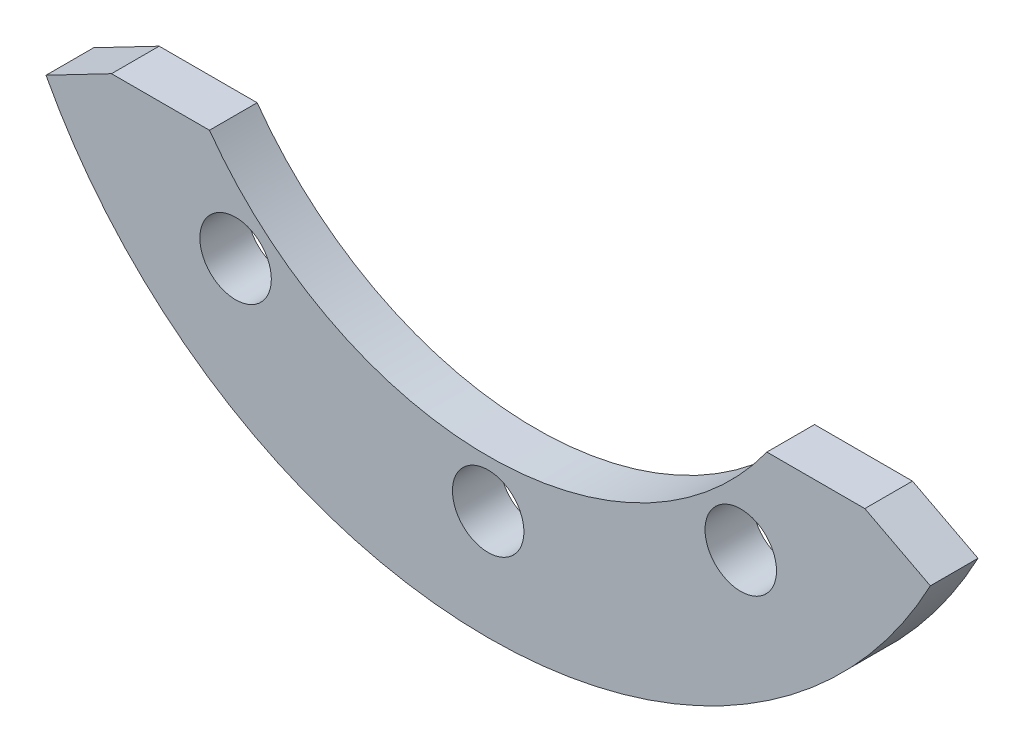
ISO-10303-21;
HEADER;
FILE_DESCRIPTION(('STEP AP214'),'2;1');
FILE_NAME('part.step','',(''),(''),'','','');
FILE_SCHEMA(('AUTOMOTIVE_DESIGN { 1 0 10303 214 1 1 1 1 }'));
ENDSEC;
DATA;
#1=APPLICATION_CONTEXT('core data for automotive mechanical design processes');
#2=APPLICATION_PROTOCOL_DEFINITION('international standard','automotive_design',2000,#1);
#3=PRODUCT_CONTEXT('',#1,'mechanical');
#4=PRODUCT('Part','Part','',(#3));
#5=PRODUCT_RELATED_PRODUCT_CATEGORY('part','',(#4));
#6=PRODUCT_DEFINITION_FORMATION('','',#4);
#7=PRODUCT_DEFINITION_CONTEXT('part definition',#1,'design');
#8=PRODUCT_DEFINITION('design','',#6,#7);
#9=PRODUCT_DEFINITION_SHAPE('','',#8);
#10=(LENGTH_UNIT() NAMED_UNIT(*) SI_UNIT(.MILLI.,.METRE.));
#11=(NAMED_UNIT(*) PLANE_ANGLE_UNIT() SI_UNIT($,.RADIAN.));
#12=(NAMED_UNIT(*) SI_UNIT($,.STERADIAN.) SOLID_ANGLE_UNIT());
#13=UNCERTAINTY_MEASURE_WITH_UNIT(LENGTH_MEASURE(1.E-05),#10,'distance_accuracy_value','');
#14=(GEOMETRIC_REPRESENTATION_CONTEXT(3) GLOBAL_UNCERTAINTY_ASSIGNED_CONTEXT((#13)) GLOBAL_UNIT_ASSIGNED_CONTEXT((#10,
#11,#12)) REPRESENTATION_CONTEXT('',''));
#15=CARTESIAN_POINT('',(0.,0.,0.));
#16=DIRECTION('',(0.,0.,1.));
#17=DIRECTION('',(1.,0.,0.));
#18=AXIS2_PLACEMENT_3D('',#15,#16,#17);
#19=CARTESIAN_POINT('',(5.84807660688538,-4.2,-1.));
#20=DIRECTION('',(0.,1.,0.));
#21=DIRECTION('',(0.,0.,1.));
#22=AXIS2_PLACEMENT_3D('',#19,#20,#21);
#23=PLANE('',#22);
#24=DIRECTION('',(-1.,0.,0.));
#25=VECTOR('',#24,1.);
#26=CARTESIAN_POINT('',(5.84807660688538,-4.2,0.));
#27=LINE('',#26,#25);
#28=CARTESIAN_POINT('',(7.90332208631282,-4.2,0.));
#29=VERTEX_POINT('',#28);
#30=CARTESIAN_POINT('',(5.84807660688538,-4.2,0.));
#31=VERTEX_POINT('',#30);
#32=EDGE_CURVE('E97',#29,#31,#27,.T.);
#33=ORIENTED_EDGE('',*,*,#32,.F.);
#34=DIRECTION('',(0.,0.,1.));
#35=VECTOR('',#34,1.);
#36=CARTESIAN_POINT('',(7.90332208631282,-4.2,-1.));
#37=LINE('',#36,#35);
#38=CARTESIAN_POINT('',(7.90332208631282,-4.2,-1.));
#39=VERTEX_POINT('',#38);
#40=EDGE_CURVE('E47',#39,#29,#37,.T.);
#41=ORIENTED_EDGE('',*,*,#40,.F.);
#42=DIRECTION('',(-1.,0.,0.));
#43=VECTOR('',#42,1.);
#44=CARTESIAN_POINT('',(5.84807660688538,-4.2,-1.));
#45=LINE('',#44,#43);
#46=CARTESIAN_POINT('',(5.84807660688538,-4.2,-1.));
#47=VERTEX_POINT('',#46);
#48=EDGE_CURVE('E95',#39,#47,#45,.T.);
#49=ORIENTED_EDGE('',*,*,#48,.T.);
#50=DIRECTION('',(0.,0.,1.));
#51=VECTOR('',#50,1.);
#52=CARTESIAN_POINT('',(5.84807660688538,-4.2,-1.));
#53=LINE('',#52,#51);
#54=EDGE_CURVE('E11',#47,#31,#53,.T.);
#55=ORIENTED_EDGE('',*,*,#54,.T.);
#56=EDGE_LOOP('',(#33,#41,#49,#55));
#57=FACE_BOUND('',#56,.T.);
#58=ADVANCED_FACE('F32',(#57),#23,.T.);
#59=CARTESIAN_POINT('',(0.,0.,-1.));
#60=DIRECTION('',(0.,0.,1.));
#61=DIRECTION('',(1.,0.,0.));
#62=AXIS2_PLACEMENT_3D('',#59,#60,#61);
#63=CYLINDRICAL_SURFACE('',#62,10.5);
#64=CARTESIAN_POINT('',(0.,0.,-1.));
#65=DIRECTION('',(0.,0.,1.));
#66=DIRECTION('',(1.,0.,0.));
#67=AXIS2_PLACEMENT_3D('',#64,#65,#66);
#68=CIRCLE('',#67,10.5);
#69=CARTESIAN_POINT('',(-9.27823124000227,-4.91573240291271,-1.));
#70=VERTEX_POINT('',#69);
#71=CARTESIAN_POINT('',(9.27823124000227,-4.91573240291271,-1.));
#72=VERTEX_POINT('',#71);
#73=EDGE_CURVE('E104',#70,#72,#68,.T.);
#74=ORIENTED_EDGE('',*,*,#73,.T.);
#75=DIRECTION('',(0.,0.,1.));
#76=VECTOR('',#75,1.);
#77=CARTESIAN_POINT('',(9.27823124000227,-4.91573240291271,-1.));
#78=LINE('',#77,#76);
#79=CARTESIAN_POINT('',(9.27823124000227,-4.91573240291271,0.));
#80=VERTEX_POINT('',#79);
#81=EDGE_CURVE('E86',#72,#80,#78,.T.);
#82=ORIENTED_EDGE('',*,*,#81,.T.);
#83=CARTESIAN_POINT('',(0.,0.,0.));
#84=DIRECTION('',(0.,0.,1.));
#85=DIRECTION('',(1.,0.,0.));
#86=AXIS2_PLACEMENT_3D('',#83,#84,#85);
#87=CIRCLE('',#86,10.5);
#88=CARTESIAN_POINT('',(-9.27823124000227,-4.91573240291271,0.));
#89=VERTEX_POINT('',#88);
#90=EDGE_CURVE('E117',#89,#80,#87,.T.);
#91=ORIENTED_EDGE('',*,*,#90,.F.);
#92=DIRECTION('',(0.,0.,1.));
#93=VECTOR('',#92,1.);
#94=CARTESIAN_POINT('',(-9.27823124000227,-4.91573240291271,-1.));
#95=LINE('',#94,#93);
#96=EDGE_CURVE('E55',#70,#89,#95,.T.);
#97=ORIENTED_EDGE('',*,*,#96,.F.);
#98=EDGE_LOOP('',(#74,#82,#91,#97));
#99=FACE_BOUND('',#98,.T.);
#100=ADVANCED_FACE('F155',(#99),#63,.T.);
#101=CARTESIAN_POINT('',(0.,0.,-1.));
#102=DIRECTION('',(0.,0.,1.));
#103=DIRECTION('',(1.,0.,0.));
#104=AXIS2_PLACEMENT_3D('',#101,#102,#103);
#105=PLANE('',#104);
#106=CARTESIAN_POINT('',(5.3,-6.25699608438426,-1.));
#107=DIRECTION('',(0.,0.,1.));
#108=DIRECTION('',(1.,0.,0.));
#109=AXIS2_PLACEMENT_3D('',#106,#107,#108);
#110=CIRCLE('',#109,0.75);
#111=CARTESIAN_POINT('',(6.05,-6.25699608438426,-1.));
#112=VERTEX_POINT('',#111);
#113=EDGE_CURVE('E114',#112,#112,#110,.T.);
#114=ORIENTED_EDGE('',*,*,#113,.T.);
#115=EDGE_LOOP('',(#114));
#116=FACE_BOUND('',#115,.T.);
#117=CARTESIAN_POINT('',(-5.3,-6.25699608438426,-1.));
#118=DIRECTION('',(0.,0.,1.));
#119=DIRECTION('',(1.,0.,0.));
#120=AXIS2_PLACEMENT_3D('',#117,#118,#119);
#121=CIRCLE('',#120,0.75);
#122=CARTESIAN_POINT('',(-4.55,-6.25699608438426,-1.));
#123=VERTEX_POINT('',#122);
#124=EDGE_CURVE('E130',#123,#123,#121,.T.);
#125=ORIENTED_EDGE('',*,*,#124,.T.);
#126=EDGE_LOOP('',(#125));
#127=FACE_BOUND('',#126,.T.);
#128=CARTESIAN_POINT('',(0.,-8.2,-1.));
#129=DIRECTION('',(0.,0.,1.));
#130=DIRECTION('',(1.,0.,0.));
#131=AXIS2_PLACEMENT_3D('',#128,#129,#130);
#132=CIRCLE('',#131,0.75);
#133=CARTESIAN_POINT('',(0.75,-8.2,-1.));
#134=VERTEX_POINT('',#133);
#135=EDGE_CURVE('E136',#134,#134,#132,.T.);
#136=ORIENTED_EDGE('',*,*,#135,.T.);
#137=EDGE_LOOP('',(#136));
#138=FACE_BOUND('',#137,.T.);
#139=DIRECTION('',(-0.887010833178223,0.461748613235031,0.));
#140=VECTOR('',#139,1.);
#141=CARTESIAN_POINT('',(7.90332208631282,-4.2,-1.));
#142=LINE('',#141,#140);
#143=EDGE_CURVE('E83',#72,#39,#142,.T.);
#144=ORIENTED_EDGE('',*,*,#143,.F.);
#145=ORIENTED_EDGE('',*,*,#73,.F.);
#146=DIRECTION('',(0.887010833178223,0.461748613235031,0.));
#147=VECTOR('',#146,1.);
#148=CARTESIAN_POINT('',(-7.90332208631282,-4.2,-1.));
#149=LINE('',#148,#147);
#150=CARTESIAN_POINT('',(-7.90332208631282,-4.2,-1.));
#151=VERTEX_POINT('',#150);
#152=EDGE_CURVE('E144',#70,#151,#149,.T.);
#153=ORIENTED_EDGE('',*,*,#152,.T.);
#154=DIRECTION('',(-1.,0.,0.));
#155=VECTOR('',#154,1.);
#156=CARTESIAN_POINT('',(-9.62340895940726,-4.2,-1.));
#157=LINE('',#156,#155);
#158=CARTESIAN_POINT('',(-5.84807660688538,-4.2,-1.));
#159=VERTEX_POINT('',#158);
#160=EDGE_CURVE('E106',#159,#151,#157,.T.);
#161=ORIENTED_EDGE('',*,*,#160,.F.);
#162=CARTESIAN_POINT('',(0.,0.,-1.));
#163=DIRECTION('',(0.,0.,-1.));
#164=DIRECTION('',(1.,0.,0.));
#165=AXIS2_PLACEMENT_3D('',#162,#163,#164);
#166=CIRCLE('',#165,7.2);
#167=EDGE_CURVE('E103',#47,#159,#166,.T.);
#168=ORIENTED_EDGE('',*,*,#167,.F.);
#169=ORIENTED_EDGE('',*,*,#48,.F.);
#170=EDGE_LOOP('',(#144,#145,#153,#161,#168,#169));
#171=FACE_BOUND('',#170,.T.);
#172=ADVANCED_FACE('F100',(#116,#127,#138,#171),#105,.F.);
#173=CARTESIAN_POINT('',(0.,0.,0.));
#174=DIRECTION('',(0.,0.,1.));
#175=DIRECTION('',(1.,0.,0.));
#176=AXIS2_PLACEMENT_3D('',#173,#174,#175);
#177=PLANE('',#176);
#178=CARTESIAN_POINT('',(0.,-8.2,0.));
#179=DIRECTION('',(0.,0.,1.));
#180=DIRECTION('',(1.,0.,0.));
#181=AXIS2_PLACEMENT_3D('',#178,#179,#180);
#182=CIRCLE('',#181,0.75);
#183=CARTESIAN_POINT('',(0.75,-8.2,0.));
#184=VERTEX_POINT('',#183);
#185=EDGE_CURVE('E139',#184,#184,#182,.T.);
#186=ORIENTED_EDGE('',*,*,#185,.F.);
#187=EDGE_LOOP('',(#186));
#188=FACE_BOUND('',#187,.T.);
#189=CARTESIAN_POINT('',(-5.3,-6.25699608438426,0.));
#190=DIRECTION('',(0.,0.,1.));
#191=DIRECTION('',(1.,0.,0.));
#192=AXIS2_PLACEMENT_3D('',#189,#190,#191);
#193=CIRCLE('',#192,0.75);
#194=CARTESIAN_POINT('',(-4.55,-6.25699608438426,0.));
#195=VERTEX_POINT('',#194);
#196=EDGE_CURVE('E133',#195,#195,#193,.T.);
#197=ORIENTED_EDGE('',*,*,#196,.F.);
#198=EDGE_LOOP('',(#197));
#199=FACE_BOUND('',#198,.T.);
#200=CARTESIAN_POINT('',(5.3,-6.25699608438426,0.));
#201=DIRECTION('',(0.,0.,1.));
#202=DIRECTION('',(1.,0.,0.));
#203=AXIS2_PLACEMENT_3D('',#200,#201,#202);
#204=CIRCLE('',#203,0.75);
#205=CARTESIAN_POINT('',(6.05,-6.25699608438426,0.));
#206=VERTEX_POINT('',#205);
#207=EDGE_CURVE('E127',#206,#206,#204,.T.);
#208=ORIENTED_EDGE('',*,*,#207,.F.);
#209=EDGE_LOOP('',(#208));
#210=FACE_BOUND('',#209,.T.);
#211=ORIENTED_EDGE('',*,*,#90,.T.);
#212=DIRECTION('',(-0.887010833178223,0.461748613235031,0.));
#213=VECTOR('',#212,1.);
#214=CARTESIAN_POINT('',(7.90332208631282,-4.2,0.));
#215=LINE('',#214,#213);
#216=EDGE_CURVE('E91',#80,#29,#215,.T.);
#217=ORIENTED_EDGE('',*,*,#216,.T.);
#218=ORIENTED_EDGE('',*,*,#32,.T.);
#219=CARTESIAN_POINT('',(0.,0.,0.));
#220=DIRECTION('',(0.,0.,-1.));
#221=DIRECTION('',(1.,0.,0.));
#222=AXIS2_PLACEMENT_3D('',#219,#220,#221);
#223=CIRCLE('',#222,7.2);
#224=CARTESIAN_POINT('',(-5.84807660688538,-4.2,0.));
#225=VERTEX_POINT('',#224);
#226=EDGE_CURVE('E110',#31,#225,#223,.T.);
#227=ORIENTED_EDGE('',*,*,#226,.T.);
#228=DIRECTION('',(-1.,0.,0.));
#229=VECTOR('',#228,1.);
#230=CARTESIAN_POINT('',(-9.62340895940726,-4.2,0.));
#231=LINE('',#230,#229);
#232=CARTESIAN_POINT('',(-7.90332208631282,-4.2,0.));
#233=VERTEX_POINT('',#232);
#234=EDGE_CURVE('E113',#225,#233,#231,.T.);
#235=ORIENTED_EDGE('',*,*,#234,.T.);
#236=DIRECTION('',(0.887010833178223,0.461748613235031,0.));
#237=VECTOR('',#236,1.);
#238=CARTESIAN_POINT('',(-7.90332208631282,-4.2,0.));
#239=LINE('',#238,#237);
#240=EDGE_CURVE('E147',#89,#233,#239,.T.);
#241=ORIENTED_EDGE('',*,*,#240,.F.);
#242=EDGE_LOOP('',(#211,#217,#218,#227,#235,#241));
#243=FACE_BOUND('',#242,.T.);
#244=ADVANCED_FACE('F152',(#188,#199,#210,#243),#177,.T.);
#245=CARTESIAN_POINT('',(0.,0.,-1.));
#246=DIRECTION('',(0.,0.,1.));
#247=DIRECTION('',(1.,0.,0.));
#248=AXIS2_PLACEMENT_3D('',#245,#246,#247);
#249=CYLINDRICAL_SURFACE('',#248,7.2);
#250=ORIENTED_EDGE('',*,*,#226,.F.);
#251=ORIENTED_EDGE('',*,*,#54,.F.);
#252=ORIENTED_EDGE('',*,*,#167,.T.);
#253=DIRECTION('',(0.,0.,1.));
#254=VECTOR('',#253,1.);
#255=CARTESIAN_POINT('',(-5.84807660688538,-4.2,-1.));
#256=LINE('',#255,#254);
#257=EDGE_CURVE('E36',#159,#225,#256,.T.);
#258=ORIENTED_EDGE('',*,*,#257,.T.);
#259=EDGE_LOOP('',(#250,#251,#252,#258));
#260=FACE_BOUND('',#259,.T.);
#261=ADVANCED_FACE('F34',(#260),#249,.F.);
#262=CARTESIAN_POINT('',(-9.62340895940726,-4.2,-1.));
#263=DIRECTION('',(0.,1.,0.));
#264=DIRECTION('',(0.,0.,1.));
#265=AXIS2_PLACEMENT_3D('',#262,#263,#264);
#266=PLANE('',#265);
#267=DIRECTION('',(0.,0.,1.));
#268=VECTOR('',#267,1.);
#269=CARTESIAN_POINT('',(-7.90332208631282,-4.2,-1.));
#270=LINE('',#269,#268);
#271=EDGE_CURVE('E142',#151,#233,#270,.T.);
#272=ORIENTED_EDGE('',*,*,#271,.T.);
#273=ORIENTED_EDGE('',*,*,#234,.F.);
#274=ORIENTED_EDGE('',*,*,#257,.F.);
#275=ORIENTED_EDGE('',*,*,#160,.T.);
#276=EDGE_LOOP('',(#272,#273,#274,#275));
#277=FACE_BOUND('',#276,.T.);
#278=ADVANCED_FACE('F157',(#277),#266,.T.);
#279=CARTESIAN_POINT('',(5.3,-6.25699608438426,0.));
#280=DIRECTION('',(0.,0.,1.));
#281=DIRECTION('',(1.,0.,0.));
#282=AXIS2_PLACEMENT_3D('',#279,#280,#281);
#283=CYLINDRICAL_SURFACE('',#282,0.75);
#284=ORIENTED_EDGE('',*,*,#113,.F.);
#285=EDGE_LOOP('',(#284));
#286=FACE_BOUND('',#285,.T.);
#287=ORIENTED_EDGE('',*,*,#207,.T.);
#288=EDGE_LOOP('',(#287));
#289=FACE_BOUND('',#288,.T.);
#290=ADVANCED_FACE('F181',(#286,#289),#283,.F.);
#291=CARTESIAN_POINT('',(-5.3,-6.25699608438426,0.));
#292=DIRECTION('',(0.,0.,1.));
#293=DIRECTION('',(1.,0.,0.));
#294=AXIS2_PLACEMENT_3D('',#291,#292,#293);
#295=CYLINDRICAL_SURFACE('',#294,0.75);
#296=ORIENTED_EDGE('',*,*,#124,.F.);
#297=EDGE_LOOP('',(#296));
#298=FACE_BOUND('',#297,.T.);
#299=ORIENTED_EDGE('',*,*,#196,.T.);
#300=EDGE_LOOP('',(#299));
#301=FACE_BOUND('',#300,.T.);
#302=ADVANCED_FACE('F169',(#298,#301),#295,.F.);
#303=CARTESIAN_POINT('',(0.,-8.2,0.));
#304=DIRECTION('',(0.,0.,1.));
#305=DIRECTION('',(1.,0.,0.));
#306=AXIS2_PLACEMENT_3D('',#303,#304,#305);
#307=CYLINDRICAL_SURFACE('',#306,0.75);
#308=ORIENTED_EDGE('',*,*,#135,.F.);
#309=EDGE_LOOP('',(#308));
#310=FACE_BOUND('',#309,.T.);
#311=ORIENTED_EDGE('',*,*,#185,.T.);
#312=EDGE_LOOP('',(#311));
#313=FACE_BOUND('',#312,.T.);
#314=ADVANCED_FACE('F162',(#310,#313),#307,.F.);
#315=CARTESIAN_POINT('',(-7.90332208631282,-4.2,-1.));
#316=DIRECTION('',(0.461748613235031,-0.887010833178223,0.));
#317=DIRECTION('',(0.887010833178223,0.461748613235031,0.));
#318=AXIS2_PLACEMENT_3D('',#315,#316,#317);
#319=PLANE('',#318);
#320=ORIENTED_EDGE('',*,*,#240,.T.);
#321=ORIENTED_EDGE('',*,*,#271,.F.);
#322=ORIENTED_EDGE('',*,*,#152,.F.);
#323=ORIENTED_EDGE('',*,*,#96,.T.);
#324=EDGE_LOOP('',(#320,#321,#322,#323));
#325=FACE_BOUND('',#324,.T.);
#326=ADVANCED_FACE('F160',(#325),#319,.F.);
#327=CARTESIAN_POINT('',(7.90332208631282,-4.2,-1.));
#328=DIRECTION('',(0.461748613235031,0.887010833178223,0.));
#329=DIRECTION('',(-0.887010833178223,0.461748613235031,0.));
#330=AXIS2_PLACEMENT_3D('',#327,#328,#329);
#331=PLANE('',#330);
#332=ORIENTED_EDGE('',*,*,#216,.F.);
#333=ORIENTED_EDGE('',*,*,#81,.F.);
#334=ORIENTED_EDGE('',*,*,#143,.T.);
#335=ORIENTED_EDGE('',*,*,#40,.T.);
#336=EDGE_LOOP('',(#332,#333,#334,#335));
#337=FACE_BOUND('',#336,.T.);
#338=ADVANCED_FACE('F84',(#337),#331,.T.);
#339=CLOSED_SHELL('',(#58,#100,#172,#244,#261,#278,#290,#302,#314,#326,#338));
#340=MANIFOLD_SOLID_BREP('B2',#339);
#341=ADVANCED_BREP_SHAPE_REPRESENTATION('',(#18,#340),#14);
#342=SHAPE_DEFINITION_REPRESENTATION(#9,#341);
ENDSEC;
END-ISO-10303-21;
